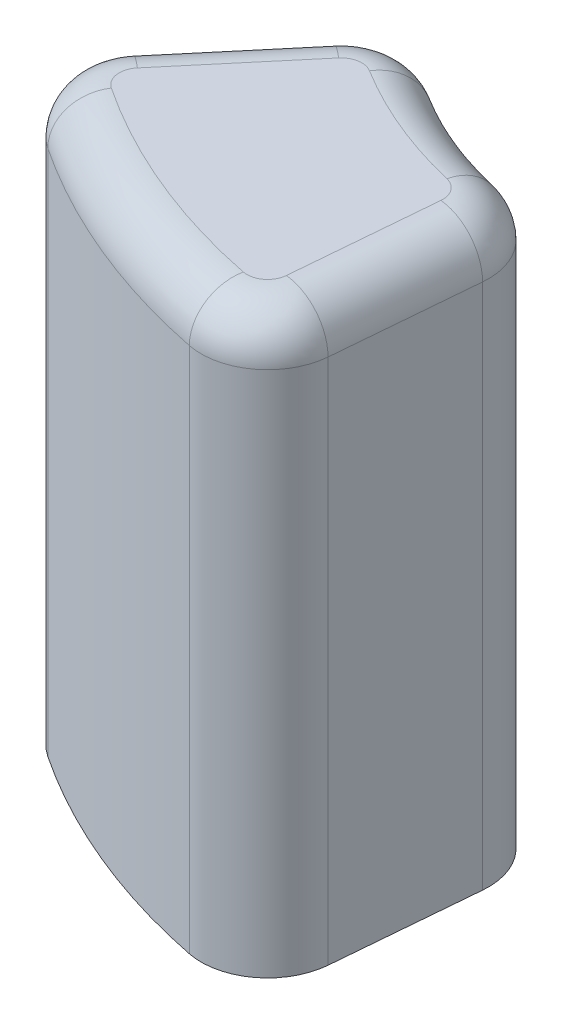
ISO-10303-21;
HEADER;
FILE_DESCRIPTION(('STEP AP214'),'2;1');
FILE_NAME('part.step','',(''),(''),'','','');
FILE_SCHEMA(('AUTOMOTIVE_DESIGN { 1 0 10303 214 1 1 1 1 }'));
ENDSEC;
DATA;
#1=APPLICATION_CONTEXT('core data for automotive mechanical design processes');
#2=APPLICATION_PROTOCOL_DEFINITION('international standard','automotive_design',2000,#1);
#3=PRODUCT_CONTEXT('',#1,'mechanical');
#4=PRODUCT('Part','Part','',(#3));
#5=PRODUCT_RELATED_PRODUCT_CATEGORY('part','',(#4));
#6=PRODUCT_DEFINITION_FORMATION('','',#4);
#7=PRODUCT_DEFINITION_CONTEXT('part definition',#1,'design');
#8=PRODUCT_DEFINITION('design','',#6,#7);
#9=PRODUCT_DEFINITION_SHAPE('','',#8);
#10=(LENGTH_UNIT() NAMED_UNIT(*) SI_UNIT(.MILLI.,.METRE.));
#11=(NAMED_UNIT(*) PLANE_ANGLE_UNIT() SI_UNIT($,.RADIAN.));
#12=(NAMED_UNIT(*) SI_UNIT($,.STERADIAN.) SOLID_ANGLE_UNIT());
#13=UNCERTAINTY_MEASURE_WITH_UNIT(LENGTH_MEASURE(1.E-05),#10,'distance_accuracy_value','');
#14=(GEOMETRIC_REPRESENTATION_CONTEXT(3) GLOBAL_UNCERTAINTY_ASSIGNED_CONTEXT((#13)) GLOBAL_UNIT_ASSIGNED_CONTEXT((#10,
#11,#12)) REPRESENTATION_CONTEXT('',''));
#15=CARTESIAN_POINT('',(0.,0.,0.));
#16=DIRECTION('',(0.,0.,1.));
#17=DIRECTION('',(1.,0.,0.));
#18=AXIS2_PLACEMENT_3D('',#15,#16,#17);
#19=CARTESIAN_POINT('',(-4.72718497191417,25.,19.9475242133281));
#20=DIRECTION('',(0.,-1.,0.));
#21=DIRECTION('',(0.,0.,-1.));
#22=AXIS2_PLACEMENT_3D('',#19,#20,#21);
#23=CYLINDRICAL_SURFACE('',#22,2.9);
#24=DIRECTION('',(0.,-1.,0.));
#25=VECTOR('',#24,1.);
#26=CARTESIAN_POINT('',(-4.05846124417998,25.,17.1256793246134));
#27=LINE('',#26,#25);
#28=CARTESIAN_POINT('',(-4.05846124417998,23.,17.1256793246134));
#29=VERTEX_POINT('',#28);
#30=CARTESIAN_POINT('',(-4.05846124417998,0.,17.1256793246134));
#31=VERTEX_POINT('',#30);
#32=EDGE_CURVE('E122',#29,#31,#27,.T.);
#33=ORIENTED_EDGE('',*,*,#32,.F.);
#34=CARTESIAN_POINT('',(-4.72718497191417,23.,19.9475242133281));
#35=DIRECTION('',(0.,1.,0.));
#36=DIRECTION('',(0.,0.,1.));
#37=AXIS2_PLACEMENT_3D('',#34,#35,#36);
#38=CIRCLE('',#37,2.9);
#39=CARTESIAN_POINT('',(-1.83785767219578,23.,20.1960956418995));
#40=VERTEX_POINT('',#39);
#41=EDGE_CURVE('E199',#29,#40,#38,.F.);
#42=ORIENTED_EDGE('',*,*,#41,.T.);
#43=DIRECTION('',(0.,-1.,0.));
#44=VECTOR('',#43,1.);
#45=CARTESIAN_POINT('',(-1.83785767219578,25.,20.1960956418995));
#46=LINE('',#45,#44);
#47=CARTESIAN_POINT('',(-1.83785767219578,0.,20.1960956418995));
#48=VERTEX_POINT('',#47);
#49=EDGE_CURVE('E146',#40,#48,#46,.T.);
#50=ORIENTED_EDGE('',*,*,#49,.T.);
#51=CARTESIAN_POINT('',(-4.72718497191417,0.,19.9475242133281));
#52=DIRECTION('',(0.,1.,0.));
#53=DIRECTION('',(0.,0.,1.));
#54=AXIS2_PLACEMENT_3D('',#51,#52,#53);
#55=CIRCLE('',#54,2.9);
#56=EDGE_CURVE('E140',#48,#31,#55,.T.);
#57=ORIENTED_EDGE('',*,*,#56,.T.);
#58=EDGE_LOOP('',(#33,#42,#50,#57));
#59=FACE_BOUND('',#58,.T.);
#60=ADVANCED_FACE('F32',(#59),#23,.T.);
#61=CARTESIAN_POINT('',(0.,25.,0.));
#62=DIRECTION('',(0.,-1.,0.));
#63=DIRECTION('',(0.,0.,-1.));
#64=AXIS2_PLACEMENT_3D('',#61,#62,#63);
#65=CYLINDRICAL_SURFACE('',#64,17.6);
#66=DIRECTION('',(0.,-1.,0.));
#67=VECTOR('',#66,1.);
#68=CARTESIAN_POINT('',(-9.2399185159179,25.,14.9794494498028));
#69=LINE('',#68,#67);
#70=CARTESIAN_POINT('',(-9.2399185159179,23.,14.9794494498028));
#71=VERTEX_POINT('',#70);
#72=CARTESIAN_POINT('',(-9.2399185159179,0.,14.9794494498028));
#73=VERTEX_POINT('',#72);
#74=EDGE_CURVE('E134',#71,#73,#69,.T.);
#75=ORIENTED_EDGE('',*,*,#74,.F.);
#76=CARTESIAN_POINT('',(0.,23.,0.));
#77=DIRECTION('',(0.,1.,0.));
#78=DIRECTION('',(0.,0.,1.));
#79=AXIS2_PLACEMENT_3D('',#76,#77,#78);
#80=CIRCLE('',#79,17.6);
#81=EDGE_CURVE('E129',#71,#29,#80,.T.);
#82=ORIENTED_EDGE('',*,*,#81,.T.);
#83=ORIENTED_EDGE('',*,*,#32,.T.);
#84=CARTESIAN_POINT('',(0.,0.,0.));
#85=DIRECTION('',(0.,-1.,0.));
#86=DIRECTION('',(0.,0.,1.));
#87=AXIS2_PLACEMENT_3D('',#84,#85,#86);
#88=CIRCLE('',#87,17.6);
#89=EDGE_CURVE('E126',#31,#73,#88,.T.);
#90=ORIENTED_EDGE('',*,*,#89,.T.);
#91=EDGE_LOOP('',(#75,#82,#83,#90));
#92=FACE_BOUND('',#91,.T.);
#93=ADVANCED_FACE('F125',(#92),#65,.F.);
#94=CARTESIAN_POINT('',(-10.7624050895635,25.,17.4476541886908));
#95=DIRECTION('',(0.,-1.,0.));
#96=DIRECTION('',(0.,0.,-1.));
#97=AXIS2_PLACEMENT_3D('',#94,#95,#96);
#98=CYLINDRICAL_SURFACE('',#97,2.9);
#99=DIRECTION('',(0.,-1.,0.));
#100=VECTOR('',#99,1.);
#101=CARTESIAN_POINT('',(-12.9812345590138,25.,15.5803578047446));
#102=LINE('',#101,#100);
#103=CARTESIAN_POINT('',(-12.9812345590138,23.,15.5803578047446));
#104=VERTEX_POINT('',#103);
#105=CARTESIAN_POINT('',(-12.9812345590138,0.,15.5803578047446));
#106=VERTEX_POINT('',#105);
#107=EDGE_CURVE('E176',#104,#106,#102,.T.);
#108=ORIENTED_EDGE('',*,*,#107,.F.);
#109=CARTESIAN_POINT('',(-10.7624050895635,23.,17.4476541886908));
#110=DIRECTION('',(0.,1.,0.));
#111=DIRECTION('',(0.,0.,1.));
#112=AXIS2_PLACEMENT_3D('',#109,#110,#111);
#113=CIRCLE('',#112,2.9);
#114=EDGE_CURVE('E195',#104,#71,#113,.F.);
#115=ORIENTED_EDGE('',*,*,#114,.T.);
#116=ORIENTED_EDGE('',*,*,#74,.T.);
#117=CARTESIAN_POINT('',(-10.7624050895635,0.,17.4476541886908));
#118=DIRECTION('',(0.,1.,0.));
#119=DIRECTION('',(0.,0.,-1.));
#120=AXIS2_PLACEMENT_3D('',#117,#118,#119);
#121=CIRCLE('',#120,2.9);
#122=EDGE_CURVE('E143',#73,#106,#121,.T.);
#123=ORIENTED_EDGE('',*,*,#122,.T.);
#124=EDGE_LOOP('',(#108,#115,#116,#123));
#125=FACE_BOUND('',#124,.T.);
#126=ADVANCED_FACE('F250',(#125),#98,.T.);
#127=CARTESIAN_POINT('',(-12.9812345590138,25.,15.5803578047446));
#128=DIRECTION('',(0.765113610155301,0.,0.643895304809036));
#129=DIRECTION('',(0.643895304809036,0.,-0.765113610155301));
#130=AXIS2_PLACEMENT_3D('',#127,#128,#129);
#131=PLANE('',#130);
#132=DIRECTION('',(0.,-1.,0.));
#133=VECTOR('',#132,1.);
#134=CARTESIAN_POINT('',(-16.9969068898231,25.,20.3520117231365));
#135=LINE('',#134,#133);
#136=CARTESIAN_POINT('',(-16.9969068898231,23.,20.3520117231365));
#137=VERTEX_POINT('',#136);
#138=CARTESIAN_POINT('',(-16.9969068898231,0.,20.3520117231365));
#139=VERTEX_POINT('',#138);
#140=EDGE_CURVE('E174',#137,#139,#135,.T.);
#141=ORIENTED_EDGE('',*,*,#140,.F.);
#142=DIRECTION('',(-0.643895304809036,0.,0.765113610155301));
#143=VECTOR('',#142,1.);
#144=CARTESIAN_POINT('',(-12.9812345590138,23.,15.5803578047446));
#145=LINE('',#144,#143);
#146=EDGE_CURVE('E11',#137,#104,#145,.F.);
#147=ORIENTED_EDGE('',*,*,#146,.T.);
#148=ORIENTED_EDGE('',*,*,#107,.T.);
#149=DIRECTION('',(-0.643895304809036,0.,0.765113610155301));
#150=VECTOR('',#149,1.);
#151=CARTESIAN_POINT('',(-12.9812345590138,0.,15.5803578047446));
#152=LINE('',#151,#150);
#153=EDGE_CURVE('E153',#106,#139,#152,.T.);
#154=ORIENTED_EDGE('',*,*,#153,.T.);
#155=EDGE_LOOP('',(#141,#147,#148,#154));
#156=FACE_BOUND('',#155,.T.);
#157=ADVANCED_FACE('F247',(#156),#131,.F.);
#158=CARTESIAN_POINT('',(-14.7780774203727,25.,22.2193081070827));
#159=DIRECTION('',(0.,-1.,0.));
#160=DIRECTION('',(0.,0.,-1.));
#161=AXIS2_PLACEMENT_3D('',#158,#159,#160);
#162=CYLINDRICAL_SURFACE('',#161,2.9);
#163=DIRECTION('',(0.,-1.,0.));
#164=VECTOR('',#163,1.);
#165=CARTESIAN_POINT('',(-16.3840892067351,25.,24.6339977645884));
#166=LINE('',#165,#164);
#167=CARTESIAN_POINT('',(-16.3840892067351,23.,24.6339977645884));
#168=VERTEX_POINT('',#167);
#169=CARTESIAN_POINT('',(-16.3840892067351,0.,24.6339977645884));
#170=VERTEX_POINT('',#169);
#171=EDGE_CURVE('E172',#168,#170,#166,.T.);
#172=ORIENTED_EDGE('',*,*,#171,.F.);
#173=CARTESIAN_POINT('',(-14.7780774203727,23.,22.2193081070827));
#174=DIRECTION('',(0.,1.,0.));
#175=DIRECTION('',(0.,0.,1.));
#176=AXIS2_PLACEMENT_3D('',#173,#174,#175);
#177=CIRCLE('',#176,2.9);
#178=EDGE_CURVE('E41',#168,#137,#177,.F.);
#179=ORIENTED_EDGE('',*,*,#178,.T.);
#180=ORIENTED_EDGE('',*,*,#140,.T.);
#181=CARTESIAN_POINT('',(-14.7780774203727,0.,22.2193081070827));
#182=DIRECTION('',(0.,1.,0.));
#183=DIRECTION('',(0.,0.,1.));
#184=AXIS2_PLACEMENT_3D('',#181,#182,#183);
#185=CIRCLE('',#184,2.9);
#186=EDGE_CURVE('E156',#139,#170,#185,.T.);
#187=ORIENTED_EDGE('',*,*,#186,.T.);
#188=EDGE_LOOP('',(#172,#179,#180,#187));
#189=FACE_BOUND('',#188,.T.);
#190=ADVANCED_FACE('F373',(#189),#162,.T.);
#191=CARTESIAN_POINT('',(0.,25.,0.));
#192=DIRECTION('',(0.,-1.,0.));
#193=DIRECTION('',(0.,0.,-1.));
#194=AXIS2_PLACEMENT_3D('',#191,#192,#193);
#195=CYLINDRICAL_SURFACE('',#194,29.585);
#196=DIRECTION('',(0.,-1.,0.));
#197=VECTOR('',#196,1.);
#198=CARTESIAN_POINT('',(-5.83356628542699,25.,29.0041674487224));
#199=LINE('',#198,#197);
#200=CARTESIAN_POINT('',(-5.83356628542699,23.,29.0041674487224));
#201=VERTEX_POINT('',#200);
#202=CARTESIAN_POINT('',(-5.83356628542699,0.,29.0041674487224));
#203=VERTEX_POINT('',#202);
#204=EDGE_CURVE('E170',#201,#203,#199,.T.);
#205=ORIENTED_EDGE('',*,*,#204,.F.);
#206=CARTESIAN_POINT('',(0.,23.,0.));
#207=DIRECTION('',(0.,1.,0.));
#208=DIRECTION('',(0.,0.,1.));
#209=AXIS2_PLACEMENT_3D('',#206,#207,#208);
#210=CIRCLE('',#209,29.585);
#211=EDGE_CURVE('E56',#201,#168,#210,.F.);
#212=ORIENTED_EDGE('',*,*,#211,.T.);
#213=ORIENTED_EDGE('',*,*,#171,.T.);
#214=CARTESIAN_POINT('',(0.,0.,0.));
#215=DIRECTION('',(0.,1.,0.));
#216=DIRECTION('',(0.,0.,1.));
#217=AXIS2_PLACEMENT_3D('',#214,#215,#216);
#218=CIRCLE('',#217,29.585);
#219=EDGE_CURVE('E159',#170,#203,#218,.T.);
#220=ORIENTED_EDGE('',*,*,#219,.T.);
#221=EDGE_LOOP('',(#205,#212,#213,#220));
#222=FACE_BOUND('',#221,.T.);
#223=ADVANCED_FACE('F364',(#222),#195,.T.);
#224=CARTESIAN_POINT('',(-5.26174467894606,25.,26.1611021926367));
#225=DIRECTION('',(0.,-1.,0.));
#226=DIRECTION('',(0.,0.,-1.));
#227=AXIS2_PLACEMENT_3D('',#224,#225,#226);
#228=CYLINDRICAL_SURFACE('',#227,2.9);
#229=DIRECTION('',(0.,-1.,0.));
#230=VECTOR('',#229,1.);
#231=CARTESIAN_POINT('',(-2.37241737922768,25.,26.4096736212082));
#232=LINE('',#231,#230);
#233=CARTESIAN_POINT('',(-2.37241737922768,23.,26.4096736212082));
#234=VERTEX_POINT('',#233);
#235=CARTESIAN_POINT('',(-2.37241737922768,0.,26.4096736212082));
#236=VERTEX_POINT('',#235);
#237=EDGE_CURVE('E168',#234,#236,#232,.T.);
#238=ORIENTED_EDGE('',*,*,#237,.F.);
#239=CARTESIAN_POINT('',(-5.26174467894606,23.,26.1611021926367));
#240=DIRECTION('',(0.,1.,0.));
#241=DIRECTION('',(0.,0.,1.));
#242=AXIS2_PLACEMENT_3D('',#239,#240,#241);
#243=CIRCLE('',#242,2.9);
#244=EDGE_CURVE('E203',#234,#201,#243,.F.);
#245=ORIENTED_EDGE('',*,*,#244,.T.);
#246=ORIENTED_EDGE('',*,*,#204,.T.);
#247=CARTESIAN_POINT('',(-5.26174467894606,0.,26.1611021926367));
#248=DIRECTION('',(0.,1.,0.));
#249=DIRECTION('',(0.,0.,-1.));
#250=AXIS2_PLACEMENT_3D('',#247,#248,#249);
#251=CIRCLE('',#250,2.9);
#252=EDGE_CURVE('E162',#203,#236,#251,.T.);
#253=ORIENTED_EDGE('',*,*,#252,.T.);
#254=EDGE_LOOP('',(#238,#245,#246,#253));
#255=FACE_BOUND('',#254,.T.);
#256=ADVANCED_FACE('F356',(#255),#228,.T.);
#257=CARTESIAN_POINT('',(-1.83785767219578,25.,20.1960956418995));
#258=DIRECTION('',(-0.996319758523583,0.,-0.0857142857142855));
#259=DIRECTION('',(-0.0857142857142855,0.,0.996319758523583));
#260=AXIS2_PLACEMENT_3D('',#257,#258,#259);
#261=PLANE('',#260);
#262=ORIENTED_EDGE('',*,*,#49,.F.);
#263=DIRECTION('',(0.0857142857142855,0.,-0.996319758523583));
#264=VECTOR('',#263,1.);
#265=CARTESIAN_POINT('',(-2.37241737922768,23.,26.4096736212082));
#266=LINE('',#265,#264);
#267=EDGE_CURVE('E201',#40,#234,#266,.F.);
#268=ORIENTED_EDGE('',*,*,#267,.T.);
#269=ORIENTED_EDGE('',*,*,#237,.T.);
#270=DIRECTION('',(0.0857142857142855,0.,-0.996319758523582));
#271=VECTOR('',#270,1.);
#272=CARTESIAN_POINT('',(-1.83785767219578,0.,20.1960956418995));
#273=LINE('',#272,#271);
#274=EDGE_CURVE('E165',#236,#48,#273,.T.);
#275=ORIENTED_EDGE('',*,*,#274,.T.);
#276=EDGE_LOOP('',(#262,#268,#269,#275));
#277=FACE_BOUND('',#276,.T.);
#278=ADVANCED_FACE('F264',(#277),#261,.F.);
#279=CARTESIAN_POINT('',(-4.72718497191417,25.,19.9475242133281));
#280=DIRECTION('',(0.,1.,0.));
#281=DIRECTION('',(0.,0.,1.));
#282=AXIS2_PLACEMENT_3D('',#279,#280,#281);
#283=PLANE('',#282);
#284=CARTESIAN_POINT('',(0.,25.,0.));
#285=DIRECTION('',(0.,1.,0.));
#286=DIRECTION('',(0.,0.,1.));
#287=AXIS2_PLACEMENT_3D('',#284,#285,#286);
#288=CIRCLE('',#287,19.6);
#289=CARTESIAN_POINT('',(-4.5196500219277,25.,19.0717792478649));
#290=VERTEX_POINT('',#289);
#291=CARTESIAN_POINT('',(-10.2899092563631,25.,16.6816596145531));
#292=VERTEX_POINT('',#291);
#293=EDGE_CURVE('E190',#290,#292,#288,.F.);
#294=ORIENTED_EDGE('',*,*,#293,.T.);
#295=CARTESIAN_POINT('',(-10.7624050895635,25.,17.4476541886908));
#296=DIRECTION('',(0.,1.,0.));
#297=DIRECTION('',(0.,0.,1.));
#298=AXIS2_PLACEMENT_3D('',#295,#296,#297);
#299=CIRCLE('',#298,0.900000000000002);
#300=CARTESIAN_POINT('',(-11.4510073387032,25.,16.8681484143626));
#301=VERTEX_POINT('',#300);
#302=EDGE_CURVE('E192',#292,#301,#299,.T.);
#303=ORIENTED_EDGE('',*,*,#302,.T.);
#304=DIRECTION('',(-0.643895304809036,0.,0.765113610155301));
#305=VECTOR('',#304,1.);
#306=CARTESIAN_POINT('',(-15.4666796695125,25.,21.6398023327546));
#307=LINE('',#306,#305);
#308=CARTESIAN_POINT('',(-15.4666796695125,25.,21.6398023327546));
#309=VERTEX_POINT('',#308);
#310=EDGE_CURVE('E133',#301,#309,#307,.T.);
#311=ORIENTED_EDGE('',*,*,#310,.T.);
#312=CARTESIAN_POINT('',(-14.7780774203727,25.,22.2193081070827));
#313=DIRECTION('',(0.,1.,0.));
#314=DIRECTION('',(0.,0.,1.));
#315=AXIS2_PLACEMENT_3D('',#312,#313,#314);
#316=CIRCLE('',#315,0.900000000000005);
#317=CARTESIAN_POINT('',(-15.2764948713128,25.,22.9686945525155));
#318=VERTEX_POINT('',#317);
#319=EDGE_CURVE('E180',#309,#318,#316,.T.);
#320=ORIENTED_EDGE('',*,*,#319,.T.);
#321=CARTESIAN_POINT('',(0.,25.,0.));
#322=DIRECTION('',(0.,1.,0.));
#323=DIRECTION('',(0.,0.,1.));
#324=AXIS2_PLACEMENT_3D('',#321,#322,#323);
#325=CIRCLE('',#324,27.585);
#326=CARTESIAN_POINT('',(-5.43920655681946,25.,27.043432789353));
#327=VERTEX_POINT('',#326);
#328=EDGE_CURVE('E182',#318,#327,#325,.T.);
#329=ORIENTED_EDGE('',*,*,#328,.T.);
#330=CARTESIAN_POINT('',(-5.26174467894606,25.,26.1611021926367));
#331=DIRECTION('',(0.,1.,0.));
#332=DIRECTION('',(0.,0.,1.));
#333=AXIS2_PLACEMENT_3D('',#330,#331,#332);
#334=CIRCLE('',#333,0.899999999999999);
#335=CARTESIAN_POINT('',(-4.36505689627484,25.,26.2382450497796));
#336=VERTEX_POINT('',#335);
#337=EDGE_CURVE('E184',#327,#336,#334,.T.);
#338=ORIENTED_EDGE('',*,*,#337,.T.);
#339=DIRECTION('',(0.0857142857142855,0.,-0.996319758523583));
#340=VECTOR('',#339,1.);
#341=CARTESIAN_POINT('',(-3.83049718924295,25.,20.0246670704709));
#342=LINE('',#341,#340);
#343=CARTESIAN_POINT('',(-3.83049718924295,25.,20.0246670704709));
#344=VERTEX_POINT('',#343);
#345=EDGE_CURVE('E186',#336,#344,#342,.T.);
#346=ORIENTED_EDGE('',*,*,#345,.T.);
#347=CARTESIAN_POINT('',(-4.72718497191417,25.,19.9475242133281));
#348=DIRECTION('',(0.,1.,0.));
#349=DIRECTION('',(0.,0.,1.));
#350=AXIS2_PLACEMENT_3D('',#347,#348,#349);
#351=CIRCLE('',#350,0.900000000000005);
#352=EDGE_CURVE('E188',#344,#290,#351,.T.);
#353=ORIENTED_EDGE('',*,*,#352,.T.);
#354=EDGE_LOOP('',(#294,#303,#311,#320,#329,#338,#346,#353));
#355=FACE_BOUND('',#354,.T.);
#356=ADVANCED_FACE('F234',(#355),#283,.T.);
#357=CARTESIAN_POINT('',(-4.72718497191417,0.,19.9475242133281));
#358=DIRECTION('',(0.,1.,0.));
#359=DIRECTION('',(0.,0.,1.));
#360=AXIS2_PLACEMENT_3D('',#357,#358,#359);
#361=PLANE('',#360);
#362=ORIENTED_EDGE('',*,*,#56,.F.);
#363=ORIENTED_EDGE('',*,*,#274,.F.);
#364=ORIENTED_EDGE('',*,*,#252,.F.);
#365=ORIENTED_EDGE('',*,*,#219,.F.);
#366=ORIENTED_EDGE('',*,*,#186,.F.);
#367=ORIENTED_EDGE('',*,*,#153,.F.);
#368=ORIENTED_EDGE('',*,*,#122,.F.);
#369=ORIENTED_EDGE('',*,*,#89,.F.);
#370=EDGE_LOOP('',(#362,#363,#364,#365,#366,#367,#368,#369));
#371=FACE_BOUND('',#370,.T.);
#372=ADVANCED_FACE('F138',(#371),#361,.F.);
#373=CARTESIAN_POINT('',(-5.26174467894606,23.,26.1611021926367));
#374=DIRECTION('',(0.,1.,0.));
#375=DIRECTION('',(0.,0.,1.));
#376=AXIS2_PLACEMENT_3D('',#373,#374,#375);
#377=DEGENERATE_TOROIDAL_SURFACE('',#376,0.899999999999999,2.,.T.);
#378=CARTESIAN_POINT('',(-5.43920655681946,23.,27.043432789353));
#379=DIRECTION('',(-0.98036732968472,0.,-0.197179864303768));
#380=DIRECTION('',(-0.197179864303768,0.,0.98036732968472));
#381=AXIS2_PLACEMENT_3D('',#378,#379,#380);
#382=CIRCLE('',#381,2.);
#383=EDGE_CURVE('E150',#201,#327,#382,.T.);
#384=ORIENTED_EDGE('',*,*,#383,.F.);
#385=ORIENTED_EDGE('',*,*,#244,.F.);
#386=CARTESIAN_POINT('',(-4.36505689627484,23.,26.2382450497796));
#387=DIRECTION('',(0.0857142857142862,0.,-0.996319758523582));
#388=DIRECTION('',(-0.996319758523582,0.,-0.0857142857142862));
#389=AXIS2_PLACEMENT_3D('',#386,#387,#388);
#390=CIRCLE('',#389,2.);
#391=EDGE_CURVE('E36',#336,#234,#390,.T.);
#392=ORIENTED_EDGE('',*,*,#391,.F.);
#393=ORIENTED_EDGE('',*,*,#337,.F.);
#394=EDGE_LOOP('',(#384,#385,#392,#393));
#395=FACE_BOUND('',#394,.T.);
#396=ADVANCED_FACE('F34',(#395),#377,.T.);
#397=CARTESIAN_POINT('',(-3.83049718924295,23.,20.0246670704709));
#398=DIRECTION('',(-0.0857142857142855,0.,0.996319758523583));
#399=DIRECTION('',(0.996319758523583,0.,0.0857142857142855));
#400=AXIS2_PLACEMENT_3D('',#397,#398,#399);
#401=CYLINDRICAL_SURFACE('',#400,2.);
#402=ORIENTED_EDGE('',*,*,#391,.T.);
#403=ORIENTED_EDGE('',*,*,#267,.F.);
#404=CARTESIAN_POINT('',(-3.83049718924295,23.,20.0246670704709));
#405=DIRECTION('',(0.0857142857142862,0.,-0.996319758523582));
#406=DIRECTION('',(-0.996319758523582,0.,-0.0857142857142862));
#407=AXIS2_PLACEMENT_3D('',#404,#405,#406);
#408=CIRCLE('',#407,2.);
#409=EDGE_CURVE('E220',#344,#40,#408,.T.);
#410=ORIENTED_EDGE('',*,*,#409,.F.);
#411=ORIENTED_EDGE('',*,*,#345,.F.);
#412=EDGE_LOOP('',(#402,#403,#410,#411));
#413=FACE_BOUND('',#412,.T.);
#414=ADVANCED_FACE('F267',(#413),#401,.T.);
#415=CARTESIAN_POINT('',(0.,23.,0.));
#416=DIRECTION('',(0.,1.,0.));
#417=DIRECTION('',(0.,0.,1.));
#418=AXIS2_PLACEMENT_3D('',#415,#416,#417);
#419=TOROIDAL_SURFACE('',#418,27.585,2.);
#420=ORIENTED_EDGE('',*,*,#383,.T.);
#421=ORIENTED_EDGE('',*,*,#328,.F.);
#422=CARTESIAN_POINT('',(-15.2764948713128,23.,22.9686945525155));
#423=DIRECTION('',(-0.832651606036451,0.,-0.553797167711175));
#424=DIRECTION('',(-0.553797167711175,0.,0.832651606036451));
#425=AXIS2_PLACEMENT_3D('',#422,#423,#424);
#426=CIRCLE('',#425,2.);
#427=EDGE_CURVE('E217',#168,#318,#426,.T.);
#428=ORIENTED_EDGE('',*,*,#427,.F.);
#429=ORIENTED_EDGE('',*,*,#211,.F.);
#430=EDGE_LOOP('',(#420,#421,#428,#429));
#431=FACE_BOUND('',#430,.T.);
#432=ADVANCED_FACE('F226',(#431),#419,.T.);
#433=CARTESIAN_POINT('',(-4.72718497191417,23.,19.9475242133281));
#434=DIRECTION('',(0.,1.,0.));
#435=DIRECTION('',(0.,0.,1.));
#436=AXIS2_PLACEMENT_3D('',#433,#434,#435);
#437=DEGENERATE_TOROIDAL_SURFACE('',#436,0.900000000000005,2.,.T.);
#438=ORIENTED_EDGE('',*,*,#409,.T.);
#439=ORIENTED_EDGE('',*,*,#41,.F.);
#440=CARTESIAN_POINT('',(-4.5196500219277,23.,19.0717792478649));
#441=DIRECTION('',(-0.973049961625759,0.,-0.230594388873862));
#442=DIRECTION('',(-0.230594388873862,0.,0.973049961625759));
#443=AXIS2_PLACEMENT_3D('',#440,#441,#442);
#444=CIRCLE('',#443,2.);
#445=EDGE_CURVE('E214',#290,#29,#444,.T.);
#446=ORIENTED_EDGE('',*,*,#445,.F.);
#447=ORIENTED_EDGE('',*,*,#352,.F.);
#448=EDGE_LOOP('',(#438,#439,#446,#447));
#449=FACE_BOUND('',#448,.T.);
#450=ADVANCED_FACE('F261',(#449),#437,.T.);
#451=CARTESIAN_POINT('',(-14.7780774203727,23.,22.2193081070827));
#452=DIRECTION('',(0.,1.,0.));
#453=DIRECTION('',(0.,0.,1.));
#454=AXIS2_PLACEMENT_3D('',#451,#452,#453);
#455=DEGENERATE_TOROIDAL_SURFACE('',#454,0.900000000000005,2.,.T.);
#456=ORIENTED_EDGE('',*,*,#427,.T.);
#457=ORIENTED_EDGE('',*,*,#319,.F.);
#458=CARTESIAN_POINT('',(-15.4666796695125,23.,21.6398023327546));
#459=DIRECTION('',(0.643895304809036,0.,-0.765113610155301));
#460=DIRECTION('',(-0.765113610155301,0.,-0.643895304809036));
#461=AXIS2_PLACEMENT_3D('',#458,#459,#460);
#462=CIRCLE('',#461,2.);
#463=EDGE_CURVE('E211',#137,#309,#462,.T.);
#464=ORIENTED_EDGE('',*,*,#463,.F.);
#465=ORIENTED_EDGE('',*,*,#178,.F.);
#466=EDGE_LOOP('',(#456,#457,#464,#465));
#467=FACE_BOUND('',#466,.T.);
#468=ADVANCED_FACE('F240',(#467),#455,.T.);
#469=CARTESIAN_POINT('',(0.,23.,0.));
#470=DIRECTION('',(0.,1.,0.));
#471=DIRECTION('',(0.,0.,1.));
#472=AXIS2_PLACEMENT_3D('',#469,#470,#471);
#473=TOROIDAL_SURFACE('',#472,19.6,2.);
#474=ORIENTED_EDGE('',*,*,#445,.T.);
#475=ORIENTED_EDGE('',*,*,#81,.F.);
#476=CARTESIAN_POINT('',(-10.2899092563631,23.,16.6816596145531));
#477=DIRECTION('',(-0.851105082375159,0.,-0.524995370222608));
#478=DIRECTION('',(-0.524995370222608,0.,0.851105082375159));
#479=AXIS2_PLACEMENT_3D('',#476,#477,#478);
#480=CIRCLE('',#479,2.);
#481=EDGE_CURVE('E209',#292,#71,#480,.T.);
#482=ORIENTED_EDGE('',*,*,#481,.F.);
#483=ORIENTED_EDGE('',*,*,#293,.F.);
#484=EDGE_LOOP('',(#474,#475,#482,#483));
#485=FACE_BOUND('',#484,.T.);
#486=ADVANCED_FACE('F257',(#485),#473,.T.);
#487=CARTESIAN_POINT('',(-10.1803666759155,23.,15.3582997519252));
#488=DIRECTION('',(0.643895304809036,0.,-0.765113610155301));
#489=DIRECTION('',(-0.765113610155301,0.,-0.643895304809036));
#490=AXIS2_PLACEMENT_3D('',#487,#488,#489);
#491=CYLINDRICAL_SURFACE('',#490,2.);
#492=ORIENTED_EDGE('',*,*,#463,.T.);
#493=ORIENTED_EDGE('',*,*,#310,.F.);
#494=CARTESIAN_POINT('',(-11.4510073387032,23.,16.8681484143626));
#495=DIRECTION('',(0.643895304809036,0.,-0.765113610155302));
#496=DIRECTION('',(-0.765113610155302,0.,-0.643895304809036));
#497=AXIS2_PLACEMENT_3D('',#494,#495,#496);
#498=CIRCLE('',#497,2.);
#499=EDGE_CURVE('E207',#104,#301,#498,.T.);
#500=ORIENTED_EDGE('',*,*,#499,.F.);
#501=ORIENTED_EDGE('',*,*,#146,.F.);
#502=EDGE_LOOP('',(#492,#493,#500,#501));
#503=FACE_BOUND('',#502,.T.);
#504=ADVANCED_FACE('F243',(#503),#491,.T.);
#505=CARTESIAN_POINT('',(-10.7624050895635,23.,17.4476541886908));
#506=DIRECTION('',(0.,1.,0.));
#507=DIRECTION('',(0.,0.,1.));
#508=AXIS2_PLACEMENT_3D('',#505,#506,#507);
#509=DEGENERATE_TOROIDAL_SURFACE('',#508,0.900000000000002,2.,.T.);
#510=ORIENTED_EDGE('',*,*,#481,.T.);
#511=ORIENTED_EDGE('',*,*,#114,.F.);
#512=ORIENTED_EDGE('',*,*,#499,.T.);
#513=ORIENTED_EDGE('',*,*,#302,.F.);
#514=EDGE_LOOP('',(#510,#511,#512,#513));
#515=FACE_BOUND('',#514,.T.);
#516=ADVANCED_FACE('F252',(#515),#509,.T.);
#517=CLOSED_SHELL('',(#60,#93,#126,#157,#190,#223,#256,#278,#356,#372,#396,#414,#432,#450,#468,
#486,#504,#516));
#518=MANIFOLD_SOLID_BREP('B2',#517);
#519=ADVANCED_BREP_SHAPE_REPRESENTATION('',(#18,#518),#14);
#520=SHAPE_DEFINITION_REPRESENTATION(#9,#519);
ENDSEC;
END-ISO-10303-21;
